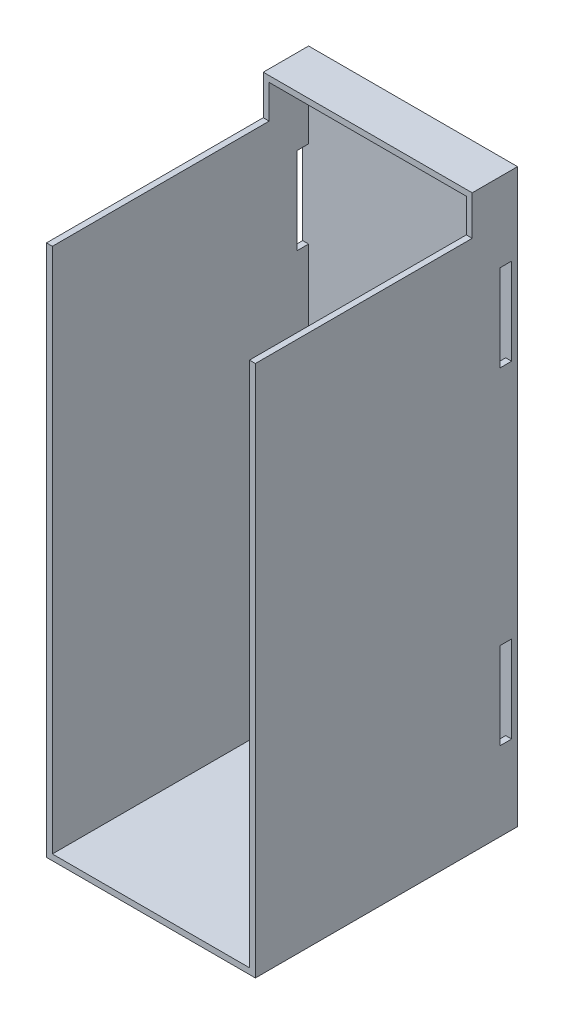
ISO-10303-21;
HEADER;
FILE_DESCRIPTION(('STEP AP214'),'2;1');
FILE_NAME('part.step','',(''),(''),'','','');
FILE_SCHEMA(('AUTOMOTIVE_DESIGN { 1 0 10303 214 1 1 1 1 }'));
ENDSEC;
DATA;
#1=APPLICATION_CONTEXT('core data for automotive mechanical design processes');
#2=APPLICATION_PROTOCOL_DEFINITION('international standard','automotive_design',2000,#1);
#3=PRODUCT_CONTEXT('',#1,'mechanical');
#4=PRODUCT('Part','Part','',(#3));
#5=PRODUCT_RELATED_PRODUCT_CATEGORY('part','',(#4));
#6=PRODUCT_DEFINITION_FORMATION('','',#4);
#7=PRODUCT_DEFINITION_CONTEXT('part definition',#1,'design');
#8=PRODUCT_DEFINITION('design','',#6,#7);
#9=PRODUCT_DEFINITION_SHAPE('','',#8);
#10=(LENGTH_UNIT() NAMED_UNIT(*) SI_UNIT(.MILLI.,.METRE.));
#11=(NAMED_UNIT(*) PLANE_ANGLE_UNIT() SI_UNIT($,.RADIAN.));
#12=(NAMED_UNIT(*) SI_UNIT($,.STERADIAN.) SOLID_ANGLE_UNIT());
#13=UNCERTAINTY_MEASURE_WITH_UNIT(LENGTH_MEASURE(1.E-05),#10,'distance_accuracy_value','');
#14=(GEOMETRIC_REPRESENTATION_CONTEXT(3) GLOBAL_UNCERTAINTY_ASSIGNED_CONTEXT((#13)) GLOBAL_UNIT_ASSIGNED_CONTEXT((#10,
#11,#12)) REPRESENTATION_CONTEXT('',''));
#15=CARTESIAN_POINT('',(0.,0.,0.));
#16=DIRECTION('',(0.,0.,1.));
#17=DIRECTION('',(1.,0.,0.));
#18=AXIS2_PLACEMENT_3D('',#15,#16,#17);
#19=CARTESIAN_POINT('',(0.,0.,1.5));
#20=DIRECTION('',(0.,0.,-1.));
#21=DIRECTION('',(-1.,0.,0.));
#22=AXIS2_PLACEMENT_3D('',#19,#20,#21);
#23=PLANE('',#22);
#24=DIRECTION('',(0.,-1.,0.));
#25=VECTOR('',#24,1.);
#26=CARTESIAN_POINT('',(51.5,1.5,1.5));
#27=LINE('',#26,#25);
#28=CARTESIAN_POINT('',(51.5,20.,1.5));
#29=VERTEX_POINT('',#28);
#30=CARTESIAN_POINT('',(51.5,1.5,1.5));
#31=VERTEX_POINT('',#30);
#32=EDGE_CURVE('E271',#29,#31,#27,.T.);
#33=ORIENTED_EDGE('',*,*,#32,.F.);
#34=DIRECTION('',(1.,0.,0.));
#35=VECTOR('',#34,1.);
#36=CARTESIAN_POINT('',(-47.,19.9999999999999,1.49999999999999));
#37=LINE('',#36,#35);
#38=CARTESIAN_POINT('',(53.,20.,1.49999999999999));
#39=VERTEX_POINT('',#38);
#40=EDGE_CURVE('E416',#29,#39,#37,.T.);
#41=ORIENTED_EDGE('',*,*,#40,.T.);
#42=DIRECTION('',(0.,1.,0.));
#43=VECTOR('',#42,1.);
#44=CARTESIAN_POINT('',(53.,42.,1.49999999999999));
#45=LINE('',#44,#43);
#46=CARTESIAN_POINT('',(53.,42.,1.49999999999999));
#47=VERTEX_POINT('',#46);
#48=EDGE_CURVE('E399',#39,#47,#45,.T.);
#49=ORIENTED_EDGE('',*,*,#48,.T.);
#50=DIRECTION('',(1.,0.,0.));
#51=VECTOR('',#50,1.);
#52=CARTESIAN_POINT('',(-47.,41.9999999999999,1.49999999999999));
#53=LINE('',#52,#51);
#54=CARTESIAN_POINT('',(51.5,42.,1.49999999999999));
#55=VERTEX_POINT('',#54);
#56=EDGE_CURVE('E412',#55,#47,#53,.T.);
#57=ORIENTED_EDGE('',*,*,#56,.F.);
#58=CARTESIAN_POINT('',(51.5,103.,1.5));
#59=VERTEX_POINT('',#58);
#60=EDGE_CURVE('E270',#59,#55,#27,.T.);
#61=ORIENTED_EDGE('',*,*,#60,.F.);
#62=DIRECTION('',(1.,0.,0.));
#63=VECTOR('',#62,1.);
#64=CARTESIAN_POINT('',(-47.,103.,1.5));
#65=LINE('',#64,#63);
#66=CARTESIAN_POINT('',(53.,103.,1.5));
#67=VERTEX_POINT('',#66);
#68=EDGE_CURVE('E386',#59,#67,#65,.T.);
#69=ORIENTED_EDGE('',*,*,#68,.T.);
#70=DIRECTION('',(0.,1.,0.));
#71=VECTOR('',#70,1.);
#72=CARTESIAN_POINT('',(53.,125.,1.5));
#73=LINE('',#72,#71);
#74=CARTESIAN_POINT('',(53.,125.,1.5));
#75=VERTEX_POINT('',#74);
#76=EDGE_CURVE('E368',#67,#75,#73,.T.);
#77=ORIENTED_EDGE('',*,*,#76,.T.);
#78=DIRECTION('',(1.,0.,0.));
#79=VECTOR('',#78,1.);
#80=CARTESIAN_POINT('',(-47.0000000000001,125.,1.5));
#81=LINE('',#80,#79);
#82=CARTESIAN_POINT('',(51.5,125.,1.5));
#83=VERTEX_POINT('',#82);
#84=EDGE_CURVE('E382',#83,#75,#81,.T.);
#85=ORIENTED_EDGE('',*,*,#84,.F.);
#86=CARTESIAN_POINT('',(51.5,143.5,1.5));
#87=VERTEX_POINT('',#86);
#88=EDGE_CURVE('E265',#87,#83,#27,.T.);
#89=ORIENTED_EDGE('',*,*,#88,.F.);
#90=DIRECTION('',(1.,0.,0.));
#91=VECTOR('',#90,1.);
#92=CARTESIAN_POINT('',(1.50000000000002,143.5,1.5));
#93=LINE('',#92,#91);
#94=CARTESIAN_POINT('',(1.5,143.5,1.5));
#95=VERTEX_POINT('',#94);
#96=EDGE_CURVE('E503',#95,#87,#93,.T.);
#97=ORIENTED_EDGE('',*,*,#96,.F.);
#98=DIRECTION('',(0.,1.,0.));
#99=VECTOR('',#98,1.);
#100=CARTESIAN_POINT('',(1.5,145.,1.5));
#101=LINE('',#100,#99);
#102=CARTESIAN_POINT('',(1.5,125.,1.5));
#103=VERTEX_POINT('',#102);
#104=EDGE_CURVE('E275',#103,#95,#101,.T.);
#105=ORIENTED_EDGE('',*,*,#104,.F.);
#106=CARTESIAN_POINT('',(0.,125.,1.5));
#107=VERTEX_POINT('',#106);
#108=EDGE_CURVE('E381',#107,#103,#81,.T.);
#109=ORIENTED_EDGE('',*,*,#108,.F.);
#110=DIRECTION('',(0.,1.,0.));
#111=VECTOR('',#110,1.);
#112=CARTESIAN_POINT('',(0.,0.,1.5));
#113=LINE('',#112,#111);
#114=CARTESIAN_POINT('',(0.,103.,1.5));
#115=VERTEX_POINT('',#114);
#116=EDGE_CURVE('E475',#115,#107,#113,.T.);
#117=ORIENTED_EDGE('',*,*,#116,.F.);
#118=CARTESIAN_POINT('',(1.50000000000001,103.,1.5));
#119=VERTEX_POINT('',#118);
#120=EDGE_CURVE('E385',#115,#119,#65,.T.);
#121=ORIENTED_EDGE('',*,*,#120,.T.);
#122=CARTESIAN_POINT('',(1.50000000000002,41.9999999999999,1.49999999999999));
#123=VERTEX_POINT('',#122);
#124=EDGE_CURVE('E280',#123,#119,#101,.T.);
#125=ORIENTED_EDGE('',*,*,#124,.F.);
#126=CARTESIAN_POINT('',(0.,41.9999999999999,1.49999999999999));
#127=VERTEX_POINT('',#126);
#128=EDGE_CURVE('E411',#127,#123,#53,.T.);
#129=ORIENTED_EDGE('',*,*,#128,.F.);
#130=DIRECTION('',(0.,1.,0.));
#131=VECTOR('',#130,1.);
#132=CARTESIAN_POINT('',(0.,0.,1.5));
#133=LINE('',#132,#131);
#134=CARTESIAN_POINT('',(0.,20.,1.49999999999999));
#135=VERTEX_POINT('',#134);
#136=EDGE_CURVE('E435',#135,#127,#133,.T.);
#137=ORIENTED_EDGE('',*,*,#136,.F.);
#138=CARTESIAN_POINT('',(1.50000000000002,20.,1.49999999999999));
#139=VERTEX_POINT('',#138);
#140=EDGE_CURVE('E415',#135,#139,#37,.T.);
#141=ORIENTED_EDGE('',*,*,#140,.T.);
#142=CARTESIAN_POINT('',(1.50000000000002,1.5,1.5));
#143=VERTEX_POINT('',#142);
#144=EDGE_CURVE('E276',#143,#139,#101,.T.);
#145=ORIENTED_EDGE('',*,*,#144,.F.);
#146=DIRECTION('',(-1.,0.,0.));
#147=VECTOR('',#146,1.);
#148=CARTESIAN_POINT('',(1.50000000000002,1.5,1.5));
#149=LINE('',#148,#147);
#150=EDGE_CURVE('E269',#31,#143,#149,.T.);
#151=ORIENTED_EDGE('',*,*,#150,.F.);
#152=EDGE_LOOP('',(#33,#41,#49,#57,#61,#69,#77,#85,#89,#97,#105,#109,#117,#121,#125,#129,#137,
#141,#145,#151));
#153=FACE_BOUND('',#152,.T.);
#154=ADVANCED_FACE('F39',(#153),#23,.F.);
#155=CARTESIAN_POINT('',(51.5,1.5,66.5));
#156=DIRECTION('',(1.,0.,0.));
#157=DIRECTION('',(0.,0.,-1.));
#158=AXIS2_PLACEMENT_3D('',#155,#156,#157);
#159=PLANE('',#158);
#160=DIRECTION('',(0.,0.,-1.));
#161=VECTOR('',#160,1.);
#162=CARTESIAN_POINT('',(51.5,135.,66.5));
#163=LINE('',#162,#161);
#164=CARTESIAN_POINT('',(51.5,135.,66.5));
#165=VERTEX_POINT('',#164);
#166=CARTESIAN_POINT('',(51.5,135.,11.5));
#167=VERTEX_POINT('',#166);
#168=EDGE_CURVE('E55',#165,#167,#163,.T.);
#169=ORIENTED_EDGE('',*,*,#168,.T.);
#170=DIRECTION('',(0.,1.,0.));
#171=VECTOR('',#170,1.);
#172=CARTESIAN_POINT('',(51.5,1.49999999999998,11.5000000000001));
#173=LINE('',#172,#171);
#174=CARTESIAN_POINT('',(51.5,143.5,11.5));
#175=VERTEX_POINT('',#174);
#176=EDGE_CURVE('E346',#167,#175,#173,.T.);
#177=ORIENTED_EDGE('',*,*,#176,.T.);
#178=DIRECTION('',(0.,0.,-1.));
#179=VECTOR('',#178,1.);
#180=CARTESIAN_POINT('',(51.5,143.5,11.5));
#181=LINE('',#180,#179);
#182=EDGE_CURVE('E330',#175,#87,#181,.T.);
#183=ORIENTED_EDGE('',*,*,#182,.T.);
#184=ORIENTED_EDGE('',*,*,#88,.T.);
#185=DIRECTION('',(0.,0.,1.));
#186=VECTOR('',#185,1.);
#187=CARTESIAN_POINT('',(51.5,125.,66.5));
#188=LINE('',#187,#186);
#189=CARTESIAN_POINT('',(51.5,125.,4.5));
#190=VERTEX_POINT('',#189);
#191=EDGE_CURVE('E487',#83,#190,#188,.T.);
#192=ORIENTED_EDGE('',*,*,#191,.T.);
#193=DIRECTION('',(0.,-1.,0.));
#194=VECTOR('',#193,1.);
#195=CARTESIAN_POINT('',(51.5,1.50000000000001,4.5));
#196=LINE('',#195,#194);
#197=CARTESIAN_POINT('',(51.5,103.,4.5));
#198=VERTEX_POINT('',#197);
#199=EDGE_CURVE('E499',#190,#198,#196,.T.);
#200=ORIENTED_EDGE('',*,*,#199,.T.);
#201=DIRECTION('',(0.,0.,-1.));
#202=VECTOR('',#201,1.);
#203=CARTESIAN_POINT('',(51.5,103.,66.5));
#204=LINE('',#203,#202);
#205=EDGE_CURVE('E471',#198,#59,#204,.T.);
#206=ORIENTED_EDGE('',*,*,#205,.T.);
#207=ORIENTED_EDGE('',*,*,#60,.T.);
#208=DIRECTION('',(0.,0.,1.));
#209=VECTOR('',#208,1.);
#210=CARTESIAN_POINT('',(51.5,42.,66.5));
#211=LINE('',#210,#209);
#212=CARTESIAN_POINT('',(51.5,42.,4.5));
#213=VERTEX_POINT('',#212);
#214=EDGE_CURVE('E447',#55,#213,#211,.T.);
#215=ORIENTED_EDGE('',*,*,#214,.T.);
#216=DIRECTION('',(0.,-1.,0.));
#217=VECTOR('',#216,1.);
#218=CARTESIAN_POINT('',(51.5,1.50000000000001,4.5));
#219=LINE('',#218,#217);
#220=CARTESIAN_POINT('',(51.5,20.,4.5));
#221=VERTEX_POINT('',#220);
#222=EDGE_CURVE('E459',#213,#221,#219,.T.);
#223=ORIENTED_EDGE('',*,*,#222,.T.);
#224=DIRECTION('',(0.,0.,-1.));
#225=VECTOR('',#224,1.);
#226=CARTESIAN_POINT('',(51.5,20.,66.5));
#227=LINE('',#226,#225);
#228=EDGE_CURVE('E431',#221,#29,#227,.T.);
#229=ORIENTED_EDGE('',*,*,#228,.T.);
#230=ORIENTED_EDGE('',*,*,#32,.T.);
#231=DIRECTION('',(0.,0.,-1.));
#232=VECTOR('',#231,1.);
#233=CARTESIAN_POINT('',(51.5,1.5,66.5));
#234=LINE('',#233,#232);
#235=CARTESIAN_POINT('',(51.5,1.5,66.5));
#236=VERTEX_POINT('',#235);
#237=EDGE_CURVE('E284',#236,#31,#234,.T.);
#238=ORIENTED_EDGE('',*,*,#237,.F.);
#239=DIRECTION('',(0.,-1.,0.));
#240=VECTOR('',#239,1.);
#241=CARTESIAN_POINT('',(51.5,1.5,66.5));
#242=LINE('',#241,#240);
#243=EDGE_CURVE('E248',#165,#236,#242,.T.);
#244=ORIENTED_EDGE('',*,*,#243,.F.);
#245=EDGE_LOOP('',(#169,#177,#183,#184,#192,#200,#206,#207,#215,#223,#229,#230,#238,#244));
#246=FACE_BOUND('',#245,.T.);
#247=ADVANCED_FACE('F565',(#246),#159,.F.);
#248=CARTESIAN_POINT('',(1.5,145.,66.5));
#249=DIRECTION('',(-1.,0.,0.));
#250=DIRECTION('',(0.,-1.,0.));
#251=AXIS2_PLACEMENT_3D('',#248,#249,#250);
#252=PLANE('',#251);
#253=DIRECTION('',(0.,0.,-1.));
#254=VECTOR('',#253,1.);
#255=CARTESIAN_POINT('',(1.50000000000002,143.5,11.5));
#256=LINE('',#255,#254);
#257=CARTESIAN_POINT('',(1.50000000000002,143.5,11.5));
#258=VERTEX_POINT('',#257);
#259=EDGE_CURVE('E512',#258,#95,#256,.T.);
#260=ORIENTED_EDGE('',*,*,#259,.F.);
#261=DIRECTION('',(0.,-1.,0.));
#262=VECTOR('',#261,1.);
#263=CARTESIAN_POINT('',(1.5,145.,11.5));
#264=LINE('',#263,#262);
#265=CARTESIAN_POINT('',(1.5,135.,11.5));
#266=VERTEX_POINT('',#265);
#267=EDGE_CURVE('E341',#258,#266,#264,.T.);
#268=ORIENTED_EDGE('',*,*,#267,.T.);
#269=DIRECTION('',(0.,0.,1.));
#270=VECTOR('',#269,1.);
#271=CARTESIAN_POINT('',(1.5,135.,66.5));
#272=LINE('',#271,#270);
#273=CARTESIAN_POINT('',(1.50000000000001,135.,66.5));
#274=VERTEX_POINT('',#273);
#275=EDGE_CURVE('E353',#266,#274,#272,.T.);
#276=ORIENTED_EDGE('',*,*,#275,.T.);
#277=DIRECTION('',(0.,1.,0.));
#278=VECTOR('',#277,1.);
#279=CARTESIAN_POINT('',(1.5,145.,66.5));
#280=LINE('',#279,#278);
#281=CARTESIAN_POINT('',(1.50000000000002,1.5,66.5));
#282=VERTEX_POINT('',#281);
#283=EDGE_CURVE('E260',#282,#274,#280,.T.);
#284=ORIENTED_EDGE('',*,*,#283,.F.);
#285=DIRECTION('',(0.,0.,-1.));
#286=VECTOR('',#285,1.);
#287=CARTESIAN_POINT('',(1.50000000000002,1.5,66.5));
#288=LINE('',#287,#286);
#289=EDGE_CURVE('E264',#282,#143,#288,.T.);
#290=ORIENTED_EDGE('',*,*,#289,.T.);
#291=ORIENTED_EDGE('',*,*,#144,.T.);
#292=DIRECTION('',(0.,0.,1.));
#293=VECTOR('',#292,1.);
#294=CARTESIAN_POINT('',(1.50000000000002,20.,66.5));
#295=LINE('',#294,#293);
#296=CARTESIAN_POINT('',(1.50000000000002,20.,4.5));
#297=VERTEX_POINT('',#296);
#298=EDGE_CURVE('E427',#139,#297,#295,.T.);
#299=ORIENTED_EDGE('',*,*,#298,.T.);
#300=DIRECTION('',(0.,1.,0.));
#301=VECTOR('',#300,1.);
#302=CARTESIAN_POINT('',(1.5,145.,4.50000000000002));
#303=LINE('',#302,#301);
#304=CARTESIAN_POINT('',(1.50000000000002,41.9999999999999,4.5));
#305=VERTEX_POINT('',#304);
#306=EDGE_CURVE('E455',#297,#305,#303,.T.);
#307=ORIENTED_EDGE('',*,*,#306,.T.);
#308=DIRECTION('',(0.,0.,-1.));
#309=VECTOR('',#308,1.);
#310=CARTESIAN_POINT('',(1.50000000000001,41.9999999999999,66.5));
#311=LINE('',#310,#309);
#312=EDGE_CURVE('E443',#305,#123,#311,.T.);
#313=ORIENTED_EDGE('',*,*,#312,.T.);
#314=ORIENTED_EDGE('',*,*,#124,.T.);
#315=DIRECTION('',(0.,0.,1.));
#316=VECTOR('',#315,1.);
#317=CARTESIAN_POINT('',(1.50000000000001,103.,66.5));
#318=LINE('',#317,#316);
#319=CARTESIAN_POINT('',(1.50000000000001,103.,4.5));
#320=VERTEX_POINT('',#319);
#321=EDGE_CURVE('E467',#119,#320,#318,.T.);
#322=ORIENTED_EDGE('',*,*,#321,.T.);
#323=DIRECTION('',(0.,1.,0.));
#324=VECTOR('',#323,1.);
#325=CARTESIAN_POINT('',(1.5,145.,4.5));
#326=LINE('',#325,#324);
#327=CARTESIAN_POINT('',(1.5,125.,4.5));
#328=VERTEX_POINT('',#327);
#329=EDGE_CURVE('E495',#320,#328,#326,.T.);
#330=ORIENTED_EDGE('',*,*,#329,.T.);
#331=DIRECTION('',(0.,0.,-1.));
#332=VECTOR('',#331,1.);
#333=CARTESIAN_POINT('',(1.5,125.,66.5));
#334=LINE('',#333,#332);
#335=EDGE_CURVE('E483',#328,#103,#334,.T.);
#336=ORIENTED_EDGE('',*,*,#335,.T.);
#337=ORIENTED_EDGE('',*,*,#104,.T.);
#338=EDGE_LOOP('',(#260,#268,#276,#284,#290,#291,#299,#307,#313,#314,#322,#330,#336,#337));
#339=FACE_BOUND('',#338,.T.);
#340=ADVANCED_FACE('F540',(#339),#252,.F.);
#341=CARTESIAN_POINT('',(0.,0.,1.5));
#342=DIRECTION('',(1.,0.,0.));
#343=DIRECTION('',(0.,0.,-1.));
#344=AXIS2_PLACEMENT_3D('',#341,#342,#343);
#345=PLANE('',#344);
#346=DIRECTION('',(0.,0.,1.));
#347=VECTOR('',#346,1.);
#348=CARTESIAN_POINT('',(0.,125.,1.5));
#349=LINE('',#348,#347);
#350=CARTESIAN_POINT('',(0.,125.,4.5));
#351=VERTEX_POINT('',#350);
#352=EDGE_CURVE('E479',#107,#351,#349,.T.);
#353=ORIENTED_EDGE('',*,*,#352,.T.);
#354=DIRECTION('',(0.,-1.,0.));
#355=VECTOR('',#354,1.);
#356=CARTESIAN_POINT('',(0.,0.,4.49999999999999));
#357=LINE('',#356,#355);
#358=CARTESIAN_POINT('',(0.,103.,4.5));
#359=VERTEX_POINT('',#358);
#360=EDGE_CURVE('E491',#351,#359,#357,.T.);
#361=ORIENTED_EDGE('',*,*,#360,.T.);
#362=DIRECTION('',(0.,0.,-1.));
#363=VECTOR('',#362,1.);
#364=CARTESIAN_POINT('',(0.,103.,1.5));
#365=LINE('',#364,#363);
#366=EDGE_CURVE('E463',#359,#115,#365,.T.);
#367=ORIENTED_EDGE('',*,*,#366,.T.);
#368=ORIENTED_EDGE('',*,*,#116,.T.);
#369=EDGE_LOOP('',(#353,#361,#367,#368));
#370=FACE_BOUND('',#369,.T.);
#371=DIRECTION('',(0.,0.,1.));
#372=VECTOR('',#371,1.);
#373=CARTESIAN_POINT('',(0.,41.9999999999999,1.5));
#374=LINE('',#373,#372);
#375=CARTESIAN_POINT('',(0.,41.9999999999999,4.5));
#376=VERTEX_POINT('',#375);
#377=EDGE_CURVE('E439',#127,#376,#374,.T.);
#378=ORIENTED_EDGE('',*,*,#377,.T.);
#379=DIRECTION('',(0.,-1.,0.));
#380=VECTOR('',#379,1.);
#381=CARTESIAN_POINT('',(0.,0.,4.5));
#382=LINE('',#381,#380);
#383=CARTESIAN_POINT('',(0.,20.,4.5));
#384=VERTEX_POINT('',#383);
#385=EDGE_CURVE('E451',#376,#384,#382,.T.);
#386=ORIENTED_EDGE('',*,*,#385,.T.);
#387=DIRECTION('',(0.,0.,-1.));
#388=VECTOR('',#387,1.);
#389=CARTESIAN_POINT('',(0.,20.,1.5));
#390=LINE('',#389,#388);
#391=EDGE_CURVE('E423',#384,#135,#390,.T.);
#392=ORIENTED_EDGE('',*,*,#391,.T.);
#393=ORIENTED_EDGE('',*,*,#136,.T.);
#394=EDGE_LOOP('',(#378,#386,#392,#393));
#395=FACE_BOUND('',#394,.T.);
#396=DIRECTION('',(0.,0.,-1.));
#397=VECTOR('',#396,1.);
#398=CARTESIAN_POINT('',(0.,135.,1.5));
#399=LINE('',#398,#397);
#400=CARTESIAN_POINT('',(0.,135.,66.5));
#401=VERTEX_POINT('',#400);
#402=CARTESIAN_POINT('',(0.,135.,11.5));
#403=VERTEX_POINT('',#402);
#404=EDGE_CURVE('E62',#401,#403,#399,.T.);
#405=ORIENTED_EDGE('',*,*,#404,.T.);
#406=DIRECTION('',(0.,1.,0.));
#407=VECTOR('',#406,1.);
#408=CARTESIAN_POINT('',(0.,0.,11.5000000000001));
#409=LINE('',#408,#407);
#410=CARTESIAN_POINT('',(0.,145.,11.5));
#411=VERTEX_POINT('',#410);
#412=EDGE_CURVE('E345',#403,#411,#409,.T.);
#413=ORIENTED_EDGE('',*,*,#412,.T.);
#414=DIRECTION('',(0.,0.,-1.));
#415=VECTOR('',#414,1.);
#416=CARTESIAN_POINT('',(0.,145.,1.5));
#417=LINE('',#416,#415);
#418=CARTESIAN_POINT('',(0.,145.,0.));
#419=VERTEX_POINT('',#418);
#420=EDGE_CURVE('E303',#411,#419,#417,.T.);
#421=ORIENTED_EDGE('',*,*,#420,.T.);
#422=DIRECTION('',(0.,-1.,0.));
#423=VECTOR('',#422,1.);
#424=CARTESIAN_POINT('',(0.,0.,0.));
#425=LINE('',#424,#423);
#426=CARTESIAN_POINT('',(0.,0.,0.));
#427=VERTEX_POINT('',#426);
#428=EDGE_CURVE('E288',#419,#427,#425,.T.);
#429=ORIENTED_EDGE('',*,*,#428,.T.);
#430=DIRECTION('',(0.,0.,-1.));
#431=VECTOR('',#430,1.);
#432=CARTESIAN_POINT('',(0.,0.,1.5));
#433=LINE('',#432,#431);
#434=CARTESIAN_POINT('',(0.,0.,66.5));
#435=VERTEX_POINT('',#434);
#436=EDGE_CURVE('E232',#435,#427,#433,.T.);
#437=ORIENTED_EDGE('',*,*,#436,.F.);
#438=DIRECTION('',(0.,-1.,0.));
#439=VECTOR('',#438,1.);
#440=CARTESIAN_POINT('',(0.,145.,66.5));
#441=LINE('',#440,#439);
#442=EDGE_CURVE('E254',#401,#435,#441,.T.);
#443=ORIENTED_EDGE('',*,*,#442,.F.);
#444=EDGE_LOOP('',(#405,#413,#421,#429,#437,#443));
#445=FACE_BOUND('',#444,.T.);
#446=ADVANCED_FACE('F41',(#370,#395,#445),#345,.F.);
#447=CARTESIAN_POINT('',(0.,0.,1.5));
#448=DIRECTION('',(0.,1.,0.));
#449=DIRECTION('',(0.,0.,1.));
#450=AXIS2_PLACEMENT_3D('',#447,#448,#449);
#451=PLANE('',#450);
#452=DIRECTION('',(1.,0.,0.));
#453=VECTOR('',#452,1.);
#454=CARTESIAN_POINT('',(0.,0.,0.));
#455=LINE('',#454,#453);
#456=CARTESIAN_POINT('',(53.,0.,0.));
#457=VERTEX_POINT('',#456);
#458=EDGE_CURVE('E292',#427,#457,#455,.T.);
#459=ORIENTED_EDGE('',*,*,#458,.T.);
#460=DIRECTION('',(0.,0.,-1.));
#461=VECTOR('',#460,1.);
#462=CARTESIAN_POINT('',(53.,0.,1.5));
#463=LINE('',#462,#461);
#464=CARTESIAN_POINT('',(53.,0.,66.5));
#465=VERTEX_POINT('',#464);
#466=EDGE_CURVE('E309',#465,#457,#463,.T.);
#467=ORIENTED_EDGE('',*,*,#466,.F.);
#468=DIRECTION('',(1.,0.,0.));
#469=VECTOR('',#468,1.);
#470=CARTESIAN_POINT('',(0.,0.,66.5));
#471=LINE('',#470,#469);
#472=EDGE_CURVE('E246',#435,#465,#471,.T.);
#473=ORIENTED_EDGE('',*,*,#472,.F.);
#474=ORIENTED_EDGE('',*,*,#436,.T.);
#475=EDGE_LOOP('',(#459,#467,#473,#474));
#476=FACE_BOUND('',#475,.T.);
#477=ADVANCED_FACE('F315',(#476),#451,.F.);
#478=CARTESIAN_POINT('',(53.,0.,1.5));
#479=DIRECTION('',(-1.,0.,0.));
#480=DIRECTION('',(0.,-1.,0.));
#481=AXIS2_PLACEMENT_3D('',#478,#479,#480);
#482=PLANE('',#481);
#483=DIRECTION('',(0.,0.,-1.));
#484=VECTOR('',#483,1.);
#485=CARTESIAN_POINT('',(53.,103.,4.5));
#486=LINE('',#485,#484);
#487=CARTESIAN_POINT('',(53.,103.,4.5));
#488=VERTEX_POINT('',#487);
#489=EDGE_CURVE('E363',#488,#67,#486,.T.);
#490=ORIENTED_EDGE('',*,*,#489,.F.);
#491=DIRECTION('',(0.,-1.,0.));
#492=VECTOR('',#491,1.);
#493=CARTESIAN_POINT('',(53.,125.,4.5));
#494=LINE('',#493,#492);
#495=CARTESIAN_POINT('',(53.,125.,4.5));
#496=VERTEX_POINT('',#495);
#497=EDGE_CURVE('E360',#496,#488,#494,.T.);
#498=ORIENTED_EDGE('',*,*,#497,.F.);
#499=DIRECTION('',(0.,0.,1.));
#500=VECTOR('',#499,1.);
#501=CARTESIAN_POINT('',(53.,125.,4.5));
#502=LINE('',#501,#500);
#503=EDGE_CURVE('E372',#75,#496,#502,.T.);
#504=ORIENTED_EDGE('',*,*,#503,.F.);
#505=ORIENTED_EDGE('',*,*,#76,.F.);
#506=EDGE_LOOP('',(#490,#498,#504,#505));
#507=FACE_BOUND('',#506,.T.);
#508=DIRECTION('',(0.,0.,-1.));
#509=VECTOR('',#508,1.);
#510=CARTESIAN_POINT('',(53.,20.,4.5));
#511=LINE('',#510,#509);
#512=CARTESIAN_POINT('',(53.,20.,4.5));
#513=VERTEX_POINT('',#512);
#514=EDGE_CURVE('E395',#513,#39,#511,.T.);
#515=ORIENTED_EDGE('',*,*,#514,.F.);
#516=DIRECTION('',(0.,-1.,0.));
#517=VECTOR('',#516,1.);
#518=CARTESIAN_POINT('',(53.,42.,4.5));
#519=LINE('',#518,#517);
#520=CARTESIAN_POINT('',(53.,42.,4.5));
#521=VERTEX_POINT('',#520);
#522=EDGE_CURVE('E359',#521,#513,#519,.T.);
#523=ORIENTED_EDGE('',*,*,#522,.F.);
#524=DIRECTION('',(0.,0.,1.));
#525=VECTOR('',#524,1.);
#526=CARTESIAN_POINT('',(53.,42.,4.5));
#527=LINE('',#526,#525);
#528=EDGE_CURVE('E403',#47,#521,#527,.T.);
#529=ORIENTED_EDGE('',*,*,#528,.F.);
#530=ORIENTED_EDGE('',*,*,#48,.F.);
#531=EDGE_LOOP('',(#515,#523,#529,#530));
#532=FACE_BOUND('',#531,.T.);
#533=DIRECTION('',(0.,0.,-1.));
#534=VECTOR('',#533,1.);
#535=CARTESIAN_POINT('',(53.,145.,1.5));
#536=LINE('',#535,#534);
#537=CARTESIAN_POINT('',(53.,145.,11.5));
#538=VERTEX_POINT('',#537);
#539=CARTESIAN_POINT('',(53.,145.,0.));
#540=VERTEX_POINT('',#539);
#541=EDGE_CURVE('E306',#538,#540,#536,.T.);
#542=ORIENTED_EDGE('',*,*,#541,.F.);
#543=DIRECTION('',(0.,1.,0.));
#544=VECTOR('',#543,1.);
#545=CARTESIAN_POINT('',(53.,145.,11.5));
#546=LINE('',#545,#544);
#547=CARTESIAN_POINT('',(53.,135.,11.5));
#548=VERTEX_POINT('',#547);
#549=EDGE_CURVE('E240',#548,#538,#546,.T.);
#550=ORIENTED_EDGE('',*,*,#549,.F.);
#551=DIRECTION('',(0.,0.,-1.));
#552=VECTOR('',#551,1.);
#553=CARTESIAN_POINT('',(53.,135.,66.5));
#554=LINE('',#553,#552);
#555=CARTESIAN_POINT('',(53.,135.,66.5));
#556=VERTEX_POINT('',#555);
#557=EDGE_CURVE('E226',#556,#548,#554,.T.);
#558=ORIENTED_EDGE('',*,*,#557,.F.);
#559=DIRECTION('',(0.,1.,0.));
#560=VECTOR('',#559,1.);
#561=CARTESIAN_POINT('',(53.,0.,66.5));
#562=LINE('',#561,#560);
#563=EDGE_CURVE('E238',#465,#556,#562,.T.);
#564=ORIENTED_EDGE('',*,*,#563,.F.);
#565=ORIENTED_EDGE('',*,*,#466,.T.);
#566=DIRECTION('',(0.,1.,0.));
#567=VECTOR('',#566,1.);
#568=CARTESIAN_POINT('',(53.,0.,0.));
#569=LINE('',#568,#567);
#570=EDGE_CURVE('E295',#457,#540,#569,.T.);
#571=ORIENTED_EDGE('',*,*,#570,.T.);
#572=EDGE_LOOP('',(#542,#550,#558,#564,#565,#571));
#573=FACE_BOUND('',#572,.T.);
#574=ADVANCED_FACE('F236',(#507,#532,#573),#482,.F.);
#575=CARTESIAN_POINT('',(0.,145.,1.5));
#576=DIRECTION('',(0.,-1.,0.));
#577=DIRECTION('',(0.,0.,-1.));
#578=AXIS2_PLACEMENT_3D('',#575,#576,#577);
#579=PLANE('',#578);
#580=ORIENTED_EDGE('',*,*,#420,.F.);
#581=DIRECTION('',(-1.,0.,0.));
#582=VECTOR('',#581,1.);
#583=CARTESIAN_POINT('',(1.50000000000001,145.,11.5));
#584=LINE('',#583,#582);
#585=EDGE_CURVE('E327',#538,#411,#584,.T.);
#586=ORIENTED_EDGE('',*,*,#585,.F.);
#587=ORIENTED_EDGE('',*,*,#541,.T.);
#588=DIRECTION('',(-1.,0.,0.));
#589=VECTOR('',#588,1.);
#590=CARTESIAN_POINT('',(0.,145.,0.));
#591=LINE('',#590,#589);
#592=EDGE_CURVE('E299',#540,#419,#591,.T.);
#593=ORIENTED_EDGE('',*,*,#592,.T.);
#594=EDGE_LOOP('',(#580,#586,#587,#593));
#595=FACE_BOUND('',#594,.T.);
#596=ADVANCED_FACE('F326',(#595),#579,.F.);
#597=CARTESIAN_POINT('',(0.,0.,0.));
#598=DIRECTION('',(0.,0.,-1.));
#599=DIRECTION('',(-1.,0.,0.));
#600=AXIS2_PLACEMENT_3D('',#597,#598,#599);
#601=PLANE('',#600);
#602=ORIENTED_EDGE('',*,*,#428,.F.);
#603=ORIENTED_EDGE('',*,*,#592,.F.);
#604=ORIENTED_EDGE('',*,*,#570,.F.);
#605=ORIENTED_EDGE('',*,*,#458,.F.);
#606=EDGE_LOOP('',(#602,#603,#604,#605));
#607=FACE_BOUND('',#606,.T.);
#608=ADVANCED_FACE('F323',(#607),#601,.T.);
#609=CARTESIAN_POINT('',(1.50000000000002,1.5,66.5));
#610=DIRECTION('',(0.,-1.,0.));
#611=DIRECTION('',(0.,0.,-1.));
#612=AXIS2_PLACEMENT_3D('',#609,#610,#611);
#613=PLANE('',#612);
#614=ORIENTED_EDGE('',*,*,#150,.T.);
#615=ORIENTED_EDGE('',*,*,#289,.F.);
#616=DIRECTION('',(-1.,0.,0.));
#617=VECTOR('',#616,1.);
#618=CARTESIAN_POINT('',(1.50000000000002,1.5,66.5));
#619=LINE('',#618,#617);
#620=EDGE_CURVE('E252',#236,#282,#619,.T.);
#621=ORIENTED_EDGE('',*,*,#620,.F.);
#622=ORIENTED_EDGE('',*,*,#237,.T.);
#623=EDGE_LOOP('',(#614,#615,#621,#622));
#624=FACE_BOUND('',#623,.T.);
#625=ADVANCED_FACE('F570',(#624),#613,.F.);
#626=CARTESIAN_POINT('',(0.,0.,66.5));
#627=DIRECTION('',(0.,0.,1.));
#628=DIRECTION('',(1.,0.,0.));
#629=AXIS2_PLACEMENT_3D('',#626,#627,#628);
#630=PLANE('',#629);
#631=DIRECTION('',(1.,0.,0.));
#632=VECTOR('',#631,1.);
#633=CARTESIAN_POINT('',(0.,135.,66.5));
#634=LINE('',#633,#632);
#635=EDGE_CURVE('E11',#401,#274,#634,.T.);
#636=ORIENTED_EDGE('',*,*,#635,.F.);
#637=ORIENTED_EDGE('',*,*,#442,.T.);
#638=ORIENTED_EDGE('',*,*,#472,.T.);
#639=ORIENTED_EDGE('',*,*,#563,.T.);
#640=EDGE_CURVE('E43',#165,#556,#634,.T.);
#641=ORIENTED_EDGE('',*,*,#640,.F.);
#642=ORIENTED_EDGE('',*,*,#243,.T.);
#643=ORIENTED_EDGE('',*,*,#620,.T.);
#644=ORIENTED_EDGE('',*,*,#283,.T.);
#645=EDGE_LOOP('',(#636,#637,#638,#639,#641,#642,#643,#644));
#646=FACE_BOUND('',#645,.T.);
#647=ADVANCED_FACE('F244',(#646),#630,.T.);
#648=CARTESIAN_POINT('',(1.50000000000002,143.5,11.5));
#649=DIRECTION('',(0.,1.,0.));
#650=DIRECTION('',(0.,0.,1.));
#651=AXIS2_PLACEMENT_3D('',#648,#649,#650);
#652=PLANE('',#651);
#653=ORIENTED_EDGE('',*,*,#96,.T.);
#654=ORIENTED_EDGE('',*,*,#182,.F.);
#655=DIRECTION('',(1.,0.,0.));
#656=VECTOR('',#655,1.);
#657=CARTESIAN_POINT('',(1.50000000000002,143.5,11.5));
#658=LINE('',#657,#656);
#659=EDGE_CURVE('E331',#258,#175,#658,.T.);
#660=ORIENTED_EDGE('',*,*,#659,.F.);
#661=ORIENTED_EDGE('',*,*,#259,.T.);
#662=EDGE_LOOP('',(#653,#654,#660,#661));
#663=FACE_BOUND('',#662,.T.);
#664=ADVANCED_FACE('F562',(#663),#652,.F.);
#665=CARTESIAN_POINT('',(0.,0.,11.5));
#666=DIRECTION('',(0.,0.,-1.));
#667=DIRECTION('',(-1.,0.,0.));
#668=AXIS2_PLACEMENT_3D('',#665,#666,#667);
#669=PLANE('',#668);
#670=ORIENTED_EDGE('',*,*,#585,.T.);
#671=ORIENTED_EDGE('',*,*,#412,.F.);
#672=DIRECTION('',(1.,0.,0.));
#673=VECTOR('',#672,1.);
#674=CARTESIAN_POINT('',(-47.,135.,11.5));
#675=LINE('',#674,#673);
#676=EDGE_CURVE('E338',#403,#266,#675,.T.);
#677=ORIENTED_EDGE('',*,*,#676,.T.);
#678=ORIENTED_EDGE('',*,*,#267,.F.);
#679=ORIENTED_EDGE('',*,*,#659,.T.);
#680=ORIENTED_EDGE('',*,*,#176,.F.);
#681=EDGE_CURVE('E334',#167,#548,#675,.T.);
#682=ORIENTED_EDGE('',*,*,#681,.T.);
#683=ORIENTED_EDGE('',*,*,#549,.T.);
#684=EDGE_LOOP('',(#670,#671,#677,#678,#679,#680,#682,#683));
#685=FACE_BOUND('',#684,.T.);
#686=ADVANCED_FACE('F333',(#685),#669,.F.);
#687=CARTESIAN_POINT('',(-47.,19.9999999999999,4.5));
#688=DIRECTION('',(0.,-1.,0.));
#689=DIRECTION('',(1.,0.,0.));
#690=AXIS2_PLACEMENT_3D('',#687,#688,#689);
#691=PLANE('',#690);
#692=DIRECTION('',(1.,0.,0.));
#693=VECTOR('',#692,1.);
#694=CARTESIAN_POINT('',(-47.,19.9999999999999,4.5));
#695=LINE('',#694,#693);
#696=EDGE_CURVE('E407',#221,#513,#695,.T.);
#697=ORIENTED_EDGE('',*,*,#696,.T.);
#698=ORIENTED_EDGE('',*,*,#514,.T.);
#699=ORIENTED_EDGE('',*,*,#40,.F.);
#700=ORIENTED_EDGE('',*,*,#228,.F.);
#701=EDGE_LOOP('',(#697,#698,#699,#700));
#702=FACE_BOUND('',#701,.T.);
#703=ADVANCED_FACE('F614',(#702),#691,.F.);
#704=CARTESIAN_POINT('',(-47.,41.9999999999999,4.5));
#705=DIRECTION('',(0.,1.,0.));
#706=DIRECTION('',(-1.,0.,0.));
#707=AXIS2_PLACEMENT_3D('',#704,#705,#706);
#708=PLANE('',#707);
#709=ORIENTED_EDGE('',*,*,#56,.T.);
#710=ORIENTED_EDGE('',*,*,#528,.T.);
#711=DIRECTION('',(1.,0.,0.));
#712=VECTOR('',#711,1.);
#713=CARTESIAN_POINT('',(-47.,41.9999999999999,4.5));
#714=LINE('',#713,#712);
#715=EDGE_CURVE('E408',#213,#521,#714,.T.);
#716=ORIENTED_EDGE('',*,*,#715,.F.);
#717=ORIENTED_EDGE('',*,*,#214,.F.);
#718=EDGE_LOOP('',(#709,#710,#716,#717));
#719=FACE_BOUND('',#718,.T.);
#720=ADVANCED_FACE('F622',(#719),#708,.F.);
#721=CARTESIAN_POINT('',(-47.,41.9999999999999,4.5));
#722=DIRECTION('',(0.,0.,1.));
#723=DIRECTION('',(0.,-1.,0.));
#724=AXIS2_PLACEMENT_3D('',#721,#722,#723);
#725=PLANE('',#724);
#726=ORIENTED_EDGE('',*,*,#715,.T.);
#727=ORIENTED_EDGE('',*,*,#522,.T.);
#728=ORIENTED_EDGE('',*,*,#696,.F.);
#729=ORIENTED_EDGE('',*,*,#222,.F.);
#730=EDGE_LOOP('',(#726,#727,#728,#729));
#731=FACE_BOUND('',#730,.T.);
#732=ADVANCED_FACE('F617',(#731),#725,.F.);
#733=CARTESIAN_POINT('',(-47.,103.,4.5));
#734=DIRECTION('',(0.,-1.,0.));
#735=DIRECTION('',(1.,0.,0.));
#736=AXIS2_PLACEMENT_3D('',#733,#734,#735);
#737=PLANE('',#736);
#738=DIRECTION('',(1.,0.,0.));
#739=VECTOR('',#738,1.);
#740=CARTESIAN_POINT('',(-47.,103.,4.5));
#741=LINE('',#740,#739);
#742=EDGE_CURVE('E376',#198,#488,#741,.T.);
#743=ORIENTED_EDGE('',*,*,#742,.T.);
#744=ORIENTED_EDGE('',*,*,#489,.T.);
#745=ORIENTED_EDGE('',*,*,#68,.F.);
#746=ORIENTED_EDGE('',*,*,#205,.F.);
#747=EDGE_LOOP('',(#743,#744,#745,#746));
#748=FACE_BOUND('',#747,.T.);
#749=ADVANCED_FACE('F625',(#748),#737,.F.);
#750=CARTESIAN_POINT('',(-47.0000000000001,125.,4.5));
#751=DIRECTION('',(0.,1.,0.));
#752=DIRECTION('',(-1.,0.,0.));
#753=AXIS2_PLACEMENT_3D('',#750,#751,#752);
#754=PLANE('',#753);
#755=ORIENTED_EDGE('',*,*,#84,.T.);
#756=ORIENTED_EDGE('',*,*,#503,.T.);
#757=DIRECTION('',(1.,0.,0.));
#758=VECTOR('',#757,1.);
#759=CARTESIAN_POINT('',(-47.0000000000001,125.,4.5));
#760=LINE('',#759,#758);
#761=EDGE_CURVE('E377',#190,#496,#760,.T.);
#762=ORIENTED_EDGE('',*,*,#761,.F.);
#763=ORIENTED_EDGE('',*,*,#191,.F.);
#764=EDGE_LOOP('',(#755,#756,#762,#763));
#765=FACE_BOUND('',#764,.T.);
#766=ADVANCED_FACE('F629',(#765),#754,.F.);
#767=CARTESIAN_POINT('',(-47.0000000000001,125.,4.5));
#768=DIRECTION('',(0.,0.,1.));
#769=DIRECTION('',(0.,-1.,0.));
#770=AXIS2_PLACEMENT_3D('',#767,#768,#769);
#771=PLANE('',#770);
#772=ORIENTED_EDGE('',*,*,#761,.T.);
#773=ORIENTED_EDGE('',*,*,#497,.T.);
#774=ORIENTED_EDGE('',*,*,#742,.F.);
#775=ORIENTED_EDGE('',*,*,#199,.F.);
#776=EDGE_LOOP('',(#772,#773,#774,#775));
#777=FACE_BOUND('',#776,.T.);
#778=ADVANCED_FACE('F631',(#777),#771,.F.);
#779=EDGE_CURVE('E419',#384,#297,#695,.T.);
#780=ORIENTED_EDGE('',*,*,#779,.F.);
#781=ORIENTED_EDGE('',*,*,#385,.F.);
#782=EDGE_CURVE('E364',#376,#305,#714,.T.);
#783=ORIENTED_EDGE('',*,*,#782,.T.);
#784=ORIENTED_EDGE('',*,*,#306,.F.);
#785=EDGE_LOOP('',(#780,#781,#783,#784));
#786=FACE_BOUND('',#785,.T.);
#787=ADVANCED_FACE('F577',(#786),#725,.F.);
#788=ORIENTED_EDGE('',*,*,#782,.F.);
#789=ORIENTED_EDGE('',*,*,#377,.F.);
#790=ORIENTED_EDGE('',*,*,#128,.T.);
#791=ORIENTED_EDGE('',*,*,#312,.F.);
#792=EDGE_LOOP('',(#788,#789,#790,#791));
#793=FACE_BOUND('',#792,.T.);
#794=ADVANCED_FACE('F580',(#793),#708,.F.);
#795=ORIENTED_EDGE('',*,*,#140,.F.);
#796=ORIENTED_EDGE('',*,*,#391,.F.);
#797=ORIENTED_EDGE('',*,*,#779,.T.);
#798=ORIENTED_EDGE('',*,*,#298,.F.);
#799=EDGE_LOOP('',(#795,#796,#797,#798));
#800=FACE_BOUND('',#799,.T.);
#801=ADVANCED_FACE('F573',(#800),#691,.F.);
#802=EDGE_CURVE('E389',#359,#320,#741,.T.);
#803=ORIENTED_EDGE('',*,*,#802,.F.);
#804=ORIENTED_EDGE('',*,*,#360,.F.);
#805=EDGE_CURVE('E380',#351,#328,#760,.T.);
#806=ORIENTED_EDGE('',*,*,#805,.T.);
#807=ORIENTED_EDGE('',*,*,#329,.F.);
#808=EDGE_LOOP('',(#803,#804,#806,#807));
#809=FACE_BOUND('',#808,.T.);
#810=ADVANCED_FACE('F552',(#809),#771,.F.);
#811=ORIENTED_EDGE('',*,*,#805,.F.);
#812=ORIENTED_EDGE('',*,*,#352,.F.);
#813=ORIENTED_EDGE('',*,*,#108,.T.);
#814=ORIENTED_EDGE('',*,*,#335,.F.);
#815=EDGE_LOOP('',(#811,#812,#813,#814));
#816=FACE_BOUND('',#815,.T.);
#817=ADVANCED_FACE('F640',(#816),#754,.F.);
#818=ORIENTED_EDGE('',*,*,#120,.F.);
#819=ORIENTED_EDGE('',*,*,#366,.F.);
#820=ORIENTED_EDGE('',*,*,#802,.T.);
#821=ORIENTED_EDGE('',*,*,#321,.F.);
#822=EDGE_LOOP('',(#818,#819,#820,#821));
#823=FACE_BOUND('',#822,.T.);
#824=ADVANCED_FACE('F548',(#823),#737,.F.);
#825=CARTESIAN_POINT('',(-47.,135.,66.5));
#826=DIRECTION('',(0.,-1.,0.));
#827=DIRECTION('',(1.,0.,0.));
#828=AXIS2_PLACEMENT_3D('',#825,#826,#827);
#829=PLANE('',#828);
#830=ORIENTED_EDGE('',*,*,#640,.T.);
#831=ORIENTED_EDGE('',*,*,#557,.T.);
#832=ORIENTED_EDGE('',*,*,#681,.F.);
#833=ORIENTED_EDGE('',*,*,#168,.F.);
#834=EDGE_LOOP('',(#830,#831,#832,#833));
#835=FACE_BOUND('',#834,.T.);
#836=ADVANCED_FACE('F225',(#835),#829,.F.);
#837=ORIENTED_EDGE('',*,*,#676,.F.);
#838=ORIENTED_EDGE('',*,*,#404,.F.);
#839=ORIENTED_EDGE('',*,*,#635,.T.);
#840=ORIENTED_EDGE('',*,*,#275,.F.);
#841=EDGE_LOOP('',(#837,#838,#839,#840));
#842=FACE_BOUND('',#841,.T.);
#843=ADVANCED_FACE('F517',(#842),#829,.F.);
#844=CLOSED_SHELL('',(#154,#247,#340,#446,#477,#574,#596,#608,#625,#647,#664,#686,#703,#720,
#732,#749,#766,#778,#787,#794,#801,#810,#817,#824,#836,#843));
#845=MANIFOLD_SOLID_BREP('B2',#844);
#846=ADVANCED_BREP_SHAPE_REPRESENTATION('',(#18,#845),#14);
#847=SHAPE_DEFINITION_REPRESENTATION(#9,#846);
ENDSEC;
END-ISO-10303-21;
